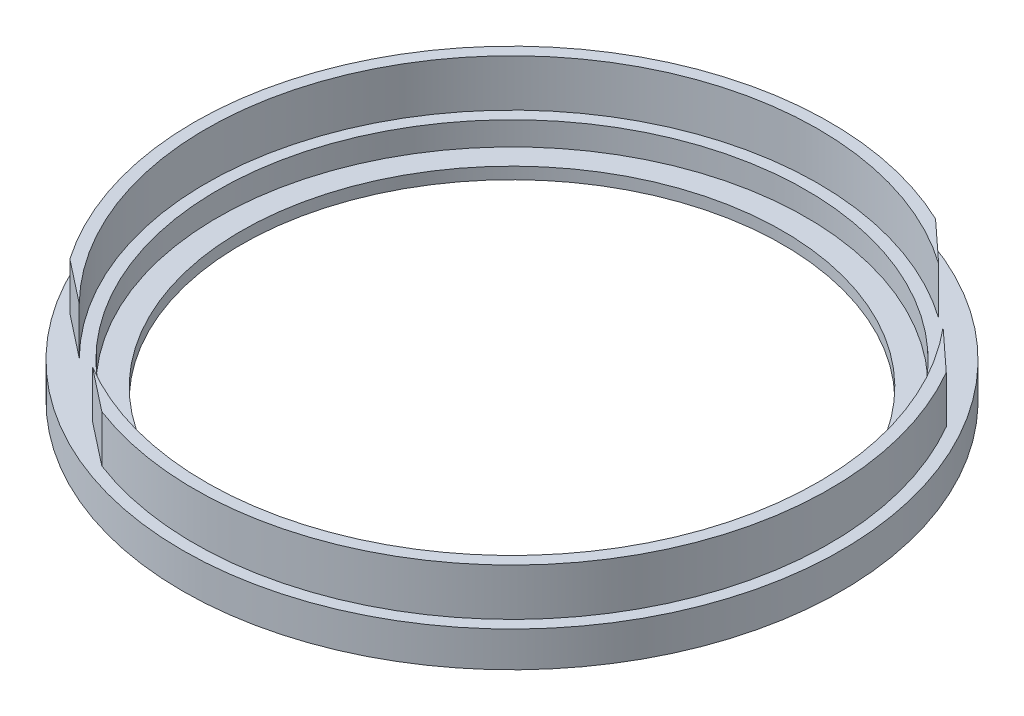
ISO-10303-21;
HEADER;
FILE_DESCRIPTION(('STEP AP214'),'2;1');
FILE_NAME('part.step','',(''),(''),'','','');
FILE_SCHEMA(('AUTOMOTIVE_DESIGN { 1 0 10303 214 1 1 1 1 }'));
ENDSEC;
DATA;
#1=APPLICATION_CONTEXT('core data for automotive mechanical design processes');
#2=APPLICATION_PROTOCOL_DEFINITION('international standard','automotive_design',2000,#1);
#3=PRODUCT_CONTEXT('',#1,'mechanical');
#4=PRODUCT('Part','Part','',(#3));
#5=PRODUCT_RELATED_PRODUCT_CATEGORY('part','',(#4));
#6=PRODUCT_DEFINITION_FORMATION('','',#4);
#7=PRODUCT_DEFINITION_CONTEXT('part definition',#1,'design');
#8=PRODUCT_DEFINITION('design','',#6,#7);
#9=PRODUCT_DEFINITION_SHAPE('','',#8);
#10=(LENGTH_UNIT() NAMED_UNIT(*) SI_UNIT(.MILLI.,.METRE.));
#11=(NAMED_UNIT(*) PLANE_ANGLE_UNIT() SI_UNIT($,.RADIAN.));
#12=(NAMED_UNIT(*) SI_UNIT($,.STERADIAN.) SOLID_ANGLE_UNIT());
#13=UNCERTAINTY_MEASURE_WITH_UNIT(LENGTH_MEASURE(1.E-05),#10,'distance_accuracy_value','');
#14=(GEOMETRIC_REPRESENTATION_CONTEXT(3) GLOBAL_UNCERTAINTY_ASSIGNED_CONTEXT((#13)) GLOBAL_UNIT_ASSIGNED_CONTEXT((#10,
#11,#12)) REPRESENTATION_CONTEXT('',''));
#15=CARTESIAN_POINT('',(0.,0.,0.));
#16=DIRECTION('',(0.,0.,1.));
#17=DIRECTION('',(1.,0.,0.));
#18=AXIS2_PLACEMENT_3D('',#15,#16,#17);
#19=CARTESIAN_POINT('',(-49.2601499183251,7.,-37.6292811876095));
#20=DIRECTION('',(0.,1.,0.));
#21=DIRECTION('',(0.,0.,1.));
#22=AXIS2_PLACEMENT_3D('',#19,#20,#21);
#23=PLANE('',#22);
#24=DIRECTION('',(-0.786877491768754,0.,-0.617109239071751));
#25=VECTOR('',#24,1.);
#26=CARTESIAN_POINT('',(-71.4689323117501,7.,-22.274477880452));
#27=LINE('',#26,#25);
#28=CARTESIAN_POINT('',(-58.8788924434501,7.,-12.400730055304));
#29=VERTEX_POINT('',#28);
#30=CARTESIAN_POINT('',(-62.5641349814272,7.,-15.2908841672153));
#31=VERTEX_POINT('',#30);
#32=EDGE_CURVE('E147',#29,#31,#27,.T.);
#33=ORIENTED_EDGE('',*,*,#32,.F.);
#34=CARTESIAN_POINT('',(-49.2601499183251,7.,-37.6292811876095));
#35=DIRECTION('',(0.,1.,0.));
#36=DIRECTION('',(0.,0.,1.));
#37=AXIS2_PLACEMENT_3D('',#34,#35,#36);
#38=CIRCLE('',#37,27.);
#39=CARTESIAN_POINT('',(-25.894954154866,7.,-51.1595297786456));
#40=VERTEX_POINT('',#39);
#41=EDGE_CURVE('E115',#29,#40,#38,.T.);
#42=ORIENTED_EDGE('',*,*,#41,.T.);
#43=DIRECTION('',(0.735026230949248,0.,0.678038671328223));
#44=VECTOR('',#43,1.);
#45=CARTESIAN_POINT('',(-37.655373850054,7.,-62.0081485198971));
#46=LINE('',#45,#44);
#47=CARTESIAN_POINT('',(-29.3373577833322,7.,-54.3350392831245));
#48=VERTEX_POINT('',#47);
#49=EDGE_CURVE('E145',#48,#40,#46,.T.);
#50=ORIENTED_EDGE('',*,*,#49,.F.);
#51=CARTESIAN_POINT('',(-49.2601499183251,7.,-37.6292811876095));
#52=DIRECTION('',(0.,1.,0.));
#53=DIRECTION('',(0.,0.,1.));
#54=AXIS2_PLACEMENT_3D('',#51,#52,#53);
#55=CIRCLE('',#54,26.);
#56=EDGE_CURVE('E126',#31,#48,#55,.T.);
#57=ORIENTED_EDGE('',*,*,#56,.F.);
#58=EDGE_LOOP('',(#33,#42,#50,#57));
#59=FACE_BOUND('',#58,.T.);
#60=ADVANCED_FACE('F34',(#59),#23,.T.);
#61=CARTESIAN_POINT('',(-49.2601499183251,7.,-37.6292811876095));
#62=DIRECTION('',(0.,-1.,0.));
#63=DIRECTION('',(0.,0.,-1.));
#64=AXIS2_PLACEMENT_3D('',#61,#62,#63);
#65=CYLINDRICAL_SURFACE('',#64,27.);
#66=CARTESIAN_POINT('',(-49.2601499183251,3.,-37.6292811876095));
#67=DIRECTION('',(0.,1.,0.));
#68=DIRECTION('',(0.,0.,1.));
#69=AXIS2_PLACEMENT_3D('',#66,#67,#68);
#70=CIRCLE('',#69,27.);
#71=CARTESIAN_POINT('',(-37.655373850054,3.,-62.0081485198971));
#72=VERTEX_POINT('',#71);
#73=CARTESIAN_POINT('',(-71.4689323117501,3.,-22.274477880452));
#74=VERTEX_POINT('',#73);
#75=EDGE_CURVE('E121',#72,#74,#70,.T.);
#76=ORIENTED_EDGE('',*,*,#75,.T.);
#77=DIRECTION('',(0.,1.,0.));
#78=VECTOR('',#77,1.);
#79=CARTESIAN_POINT('',(-71.4689323117501,3.,-22.274477880452));
#80=LINE('',#79,#78);
#81=CARTESIAN_POINT('',(-71.4689323117501,7.,-22.274477880452));
#82=VERTEX_POINT('',#81);
#83=EDGE_CURVE('E116',#74,#82,#80,.T.);
#84=ORIENTED_EDGE('',*,*,#83,.T.);
#85=CARTESIAN_POINT('',(-37.655373850054,7.,-62.0081485198971));
#86=VERTEX_POINT('',#85);
#87=EDGE_CURVE('E134',#86,#82,#38,.T.);
#88=ORIENTED_EDGE('',*,*,#87,.F.);
#89=DIRECTION('',(0.,1.,0.));
#90=VECTOR('',#89,1.);
#91=CARTESIAN_POINT('',(-37.655373850054,3.,-62.0081485198971));
#92=LINE('',#91,#90);
#93=EDGE_CURVE('E156',#72,#86,#92,.T.);
#94=ORIENTED_EDGE('',*,*,#93,.F.);
#95=EDGE_LOOP('',(#76,#84,#88,#94));
#96=FACE_BOUND('',#95,.T.);
#97=ADVANCED_FACE('F196',(#96),#65,.T.);
#98=CARTESIAN_POINT('',(-49.2601499183251,7.,-37.6292811876095));
#99=DIRECTION('',(0.,-1.,0.));
#100=DIRECTION('',(0.,0.,-1.));
#101=AXIS2_PLACEMENT_3D('',#98,#99,#100);
#102=CYLINDRICAL_SURFACE('',#101,26.);
#103=DIRECTION('',(0.,-1.,0.));
#104=VECTOR('',#103,1.);
#105=CARTESIAN_POINT('',(-62.5641349814272,7.,-15.2908841672153));
#106=LINE('',#105,#104);
#107=CARTESIAN_POINT('',(-62.5641349814272,3.,-15.2908841672153));
#108=VERTEX_POINT('',#107);
#109=EDGE_CURVE('E104',#31,#108,#106,.T.);
#110=ORIENTED_EDGE('',*,*,#109,.F.);
#111=ORIENTED_EDGE('',*,*,#56,.T.);
#112=DIRECTION('',(0.,-1.,0.));
#113=VECTOR('',#112,1.);
#114=CARTESIAN_POINT('',(-29.3373577833323,7.,-54.3350392831246));
#115=LINE('',#114,#113);
#116=CARTESIAN_POINT('',(-29.3373577833323,3.,-54.3350392831246));
#117=VERTEX_POINT('',#116);
#118=EDGE_CURVE('E153',#117,#48,#115,.F.);
#119=ORIENTED_EDGE('',*,*,#118,.F.);
#120=CARTESIAN_POINT('',(-49.2601499183251,3.,-37.6292811876095));
#121=DIRECTION('',(0.,1.,0.));
#122=DIRECTION('',(0.,0.,1.));
#123=AXIS2_PLACEMENT_3D('',#120,#121,#122);
#124=CIRCLE('',#123,26.);
#125=EDGE_CURVE('E38',#117,#108,#124,.F.);
#126=ORIENTED_EDGE('',*,*,#125,.T.);
#127=EDGE_LOOP('',(#110,#111,#119,#126));
#128=FACE_BOUND('',#127,.T.);
#129=ADVANCED_FACE('F180',(#128),#102,.F.);
#130=CARTESIAN_POINT('',(-49.2601499183251,3.,-37.6292811876095));
#131=DIRECTION('',(0.,-1.,0.));
#132=DIRECTION('',(0.,0.,-1.));
#133=AXIS2_PLACEMENT_3D('',#130,#131,#132);
#134=CYLINDRICAL_SURFACE('',#133,28.);
#135=CARTESIAN_POINT('',(-49.2601499183251,3.,-37.6292811876095));
#136=DIRECTION('',(0.,1.,0.));
#137=DIRECTION('',(0.,0.,1.));
#138=AXIS2_PLACEMENT_3D('',#135,#136,#137);
#139=CIRCLE('',#138,28.);
#140=CARTESIAN_POINT('',(-49.2601499183251,3.,-9.62928118760946));
#141=VERTEX_POINT('',#140);
#142=EDGE_CURVE('E130',#141,#141,#139,.T.);
#143=ORIENTED_EDGE('',*,*,#142,.F.);
#144=EDGE_LOOP('',(#143));
#145=FACE_BOUND('',#144,.T.);
#146=CARTESIAN_POINT('',(-49.2601499183251,0.,-37.6292811876095));
#147=DIRECTION('',(0.,1.,0.));
#148=DIRECTION('',(0.,0.,1.));
#149=AXIS2_PLACEMENT_3D('',#146,#147,#148);
#150=CIRCLE('',#149,28.);
#151=CARTESIAN_POINT('',(-49.2601499183251,0.,-9.62928118760946));
#152=VERTEX_POINT('',#151);
#153=EDGE_CURVE('E132',#152,#152,#150,.T.);
#154=ORIENTED_EDGE('',*,*,#153,.T.);
#155=EDGE_LOOP('',(#154));
#156=FACE_BOUND('',#155,.T.);
#157=ADVANCED_FACE('F36',(#145,#156),#134,.T.);
#158=CARTESIAN_POINT('',(-49.2601499183251,3.,-37.6292811876095));
#159=DIRECTION('',(0.,1.,0.));
#160=DIRECTION('',(0.,0.,1.));
#161=AXIS2_PLACEMENT_3D('',#158,#159,#160);
#162=PLANE('',#161);
#163=ORIENTED_EDGE('',*,*,#142,.T.);
#164=EDGE_LOOP('',(#163));
#165=FACE_BOUND('',#164,.T.);
#166=CARTESIAN_POINT('',(-58.8788924434501,3.,-12.400730055304));
#167=VERTEX_POINT('',#166);
#168=CARTESIAN_POINT('',(-25.894954154866,3.,-51.1595297786456));
#169=VERTEX_POINT('',#168);
#170=EDGE_CURVE('E113',#167,#169,#70,.T.);
#171=ORIENTED_EDGE('',*,*,#170,.F.);
#172=DIRECTION('',(-0.786877491768754,0.,-0.617109239071751));
#173=VECTOR('',#172,1.);
#174=CARTESIAN_POINT('',(-71.4689323117501,3.,-22.274477880452));
#175=LINE('',#174,#173);
#176=EDGE_CURVE('E57',#167,#108,#175,.T.);
#177=ORIENTED_EDGE('',*,*,#176,.T.);
#178=ORIENTED_EDGE('',*,*,#125,.F.);
#179=DIRECTION('',(0.735026230949248,0.,0.678038671328223));
#180=VECTOR('',#179,1.);
#181=CARTESIAN_POINT('',(-37.655373850054,3.,-62.0081485198971));
#182=LINE('',#181,#180);
#183=EDGE_CURVE('E119',#117,#169,#182,.T.);
#184=ORIENTED_EDGE('',*,*,#183,.T.);
#185=EDGE_LOOP('',(#171,#177,#178,#184));
#186=FACE_BOUND('',#185,.T.);
#187=CARTESIAN_POINT('',(-67.783689773773,3.,-19.3843237685407));
#188=VERTEX_POINT('',#187);
#189=EDGE_CURVE('E106',#188,#74,#175,.T.);
#190=ORIENTED_EDGE('',*,*,#189,.T.);
#191=ORIENTED_EDGE('',*,*,#75,.F.);
#192=CARTESIAN_POINT('',(-34.2129702215877,3.,-58.8326390154181));
#193=VERTEX_POINT('',#192);
#194=EDGE_CURVE('E49',#72,#193,#182,.T.);
#195=ORIENTED_EDGE('',*,*,#194,.T.);
#196=EDGE_CURVE('E11',#188,#193,#124,.F.);
#197=ORIENTED_EDGE('',*,*,#196,.F.);
#198=EDGE_LOOP('',(#190,#191,#195,#197));
#199=FACE_BOUND('',#198,.T.);
#200=CARTESIAN_POINT('',(-49.2601499183251,3.,-37.6292811876095));
#201=DIRECTION('',(0.,1.,0.));
#202=DIRECTION('',(0.,0.,1.));
#203=AXIS2_PLACEMENT_3D('',#200,#201,#202);
#204=CIRCLE('',#203,25.);
#205=CARTESIAN_POINT('',(-49.2601499183251,3.,-12.6292811876095));
#206=VERTEX_POINT('',#205);
#207=EDGE_CURVE('E171',#206,#206,#204,.T.);
#208=ORIENTED_EDGE('',*,*,#207,.F.);
#209=EDGE_LOOP('',(#208));
#210=FACE_BOUND('',#209,.T.);
#211=ADVANCED_FACE('F118',(#165,#186,#199,#210),#162,.T.);
#212=CARTESIAN_POINT('',(-49.2601499183251,0.,-37.6292811876095));
#213=DIRECTION('',(0.,1.,0.));
#214=DIRECTION('',(0.,0.,1.));
#215=AXIS2_PLACEMENT_3D('',#212,#213,#214);
#216=PLANE('',#215);
#217=CARTESIAN_POINT('',(-49.2601499183251,0.,-37.6292811876095));
#218=DIRECTION('',(0.,1.,0.));
#219=DIRECTION('',(0.,0.,1.));
#220=AXIS2_PLACEMENT_3D('',#217,#218,#219);
#221=CIRCLE('',#220,23.);
#222=CARTESIAN_POINT('',(-49.2601499183251,0.,-14.6292811876095));
#223=VERTEX_POINT('',#222);
#224=EDGE_CURVE('E168',#223,#223,#221,.T.);
#225=ORIENTED_EDGE('',*,*,#224,.T.);
#226=EDGE_LOOP('',(#225));
#227=FACE_BOUND('',#226,.T.);
#228=ORIENTED_EDGE('',*,*,#153,.F.);
#229=EDGE_LOOP('',(#228));
#230=FACE_BOUND('',#229,.T.);
#231=ADVANCED_FACE('F206',(#227,#230),#216,.F.);
#232=CARTESIAN_POINT('',(-67.783689773773,7.,-19.3843237685407));
#233=VERTEX_POINT('',#232);
#234=EDGE_CURVE('E148',#233,#82,#27,.T.);
#235=ORIENTED_EDGE('',*,*,#234,.F.);
#236=CARTESIAN_POINT('',(-34.2129702215877,7.,-58.8326390154181));
#237=VERTEX_POINT('',#236);
#238=EDGE_CURVE('E122',#237,#233,#55,.T.);
#239=ORIENTED_EDGE('',*,*,#238,.F.);
#240=EDGE_CURVE('E157',#86,#237,#46,.T.);
#241=ORIENTED_EDGE('',*,*,#240,.F.);
#242=ORIENTED_EDGE('',*,*,#87,.T.);
#243=EDGE_LOOP('',(#235,#239,#241,#242));
#244=FACE_BOUND('',#243,.T.);
#245=ADVANCED_FACE('F198',(#244),#23,.T.);
#246=ORIENTED_EDGE('',*,*,#41,.F.);
#247=DIRECTION('',(0.,1.,0.));
#248=VECTOR('',#247,1.);
#249=CARTESIAN_POINT('',(-58.8788924434501,3.,-12.400730055304));
#250=LINE('',#249,#248);
#251=EDGE_CURVE('E101',#167,#29,#250,.T.);
#252=ORIENTED_EDGE('',*,*,#251,.F.);
#253=ORIENTED_EDGE('',*,*,#170,.T.);
#254=DIRECTION('',(0.,1.,0.));
#255=VECTOR('',#254,1.);
#256=CARTESIAN_POINT('',(-25.894954154866,3.,-51.1595297786456));
#257=LINE('',#256,#255);
#258=EDGE_CURVE('E150',#169,#40,#257,.T.);
#259=ORIENTED_EDGE('',*,*,#258,.T.);
#260=EDGE_LOOP('',(#246,#252,#253,#259));
#261=FACE_BOUND('',#260,.T.);
#262=ADVANCED_FACE('F111',(#261),#65,.T.);
#263=DIRECTION('',(0.,-1.,0.));
#264=VECTOR('',#263,1.);
#265=CARTESIAN_POINT('',(-67.783689773773,7.,-19.3843237685407));
#266=LINE('',#265,#264);
#267=EDGE_CURVE('E164',#188,#233,#266,.F.);
#268=ORIENTED_EDGE('',*,*,#267,.F.);
#269=ORIENTED_EDGE('',*,*,#196,.T.);
#270=DIRECTION('',(0.,-1.,0.));
#271=VECTOR('',#270,1.);
#272=CARTESIAN_POINT('',(-34.2129702215877,7.,-58.8326390154181));
#273=LINE('',#272,#271);
#274=EDGE_CURVE('E162',#237,#193,#273,.T.);
#275=ORIENTED_EDGE('',*,*,#274,.F.);
#276=ORIENTED_EDGE('',*,*,#238,.T.);
#277=EDGE_LOOP('',(#268,#269,#275,#276));
#278=FACE_BOUND('',#277,.T.);
#279=ADVANCED_FACE('F211',(#278),#102,.F.);
#280=CARTESIAN_POINT('',(-49.2601499183251,1.,-37.6292811876095));
#281=DIRECTION('',(0.,1.,0.));
#282=DIRECTION('',(0.,0.,1.));
#283=AXIS2_PLACEMENT_3D('',#280,#281,#282);
#284=CYLINDRICAL_SURFACE('',#283,25.);
#285=CARTESIAN_POINT('',(-49.2601499183251,1.,-37.6292811876095));
#286=DIRECTION('',(0.,1.,0.));
#287=DIRECTION('',(0.,0.,1.));
#288=AXIS2_PLACEMENT_3D('',#285,#286,#287);
#289=CIRCLE('',#288,25.);
#290=CARTESIAN_POINT('',(-49.2601499183251,1.,-12.6292811876095));
#291=VERTEX_POINT('',#290);
#292=EDGE_CURVE('E174',#291,#291,#289,.T.);
#293=ORIENTED_EDGE('',*,*,#292,.F.);
#294=EDGE_LOOP('',(#293));
#295=FACE_BOUND('',#294,.T.);
#296=ORIENTED_EDGE('',*,*,#207,.T.);
#297=EDGE_LOOP('',(#296));
#298=FACE_BOUND('',#297,.T.);
#299=ADVANCED_FACE('F226',(#295,#298),#284,.F.);
#300=CARTESIAN_POINT('',(-49.2601499183251,1.,-37.6292811876095));
#301=DIRECTION('',(0.,1.,0.));
#302=DIRECTION('',(0.,0.,1.));
#303=AXIS2_PLACEMENT_3D('',#300,#301,#302);
#304=PLANE('',#303);
#305=CARTESIAN_POINT('',(-49.2601499183251,1.,-37.6292811876095));
#306=DIRECTION('',(0.,1.,0.));
#307=DIRECTION('',(0.,0.,1.));
#308=AXIS2_PLACEMENT_3D('',#305,#306,#307);
#309=CIRCLE('',#308,23.);
#310=CARTESIAN_POINT('',(-49.2601499183251,1.,-14.6292811876095));
#311=VERTEX_POINT('',#310);
#312=EDGE_CURVE('E167',#311,#311,#309,.T.);
#313=ORIENTED_EDGE('',*,*,#312,.F.);
#314=EDGE_LOOP('',(#313));
#315=FACE_BOUND('',#314,.T.);
#316=ORIENTED_EDGE('',*,*,#292,.T.);
#317=EDGE_LOOP('',(#316));
#318=FACE_BOUND('',#317,.T.);
#319=ADVANCED_FACE('F228',(#315,#318),#304,.T.);
#320=CARTESIAN_POINT('',(-49.2601499183251,0.,-37.6292811876095));
#321=DIRECTION('',(0.,1.,0.));
#322=DIRECTION('',(0.,0.,1.));
#323=AXIS2_PLACEMENT_3D('',#320,#321,#322);
#324=CYLINDRICAL_SURFACE('',#323,23.);
#325=ORIENTED_EDGE('',*,*,#224,.F.);
#326=EDGE_LOOP('',(#325));
#327=FACE_BOUND('',#326,.T.);
#328=ORIENTED_EDGE('',*,*,#312,.T.);
#329=EDGE_LOOP('',(#328));
#330=FACE_BOUND('',#329,.T.);
#331=ADVANCED_FACE('F192',(#327,#330),#324,.F.);
#332=CARTESIAN_POINT('',(-37.655373850054,3.,-62.0081485198971));
#333=DIRECTION('',(-0.678038671328223,0.,0.735026230949248));
#334=DIRECTION('',(0.735026230949248,0.,0.678038671328223));
#335=AXIS2_PLACEMENT_3D('',#332,#333,#334);
#336=PLANE('',#335);
#337=ORIENTED_EDGE('',*,*,#274,.T.);
#338=ORIENTED_EDGE('',*,*,#194,.F.);
#339=ORIENTED_EDGE('',*,*,#93,.T.);
#340=ORIENTED_EDGE('',*,*,#240,.T.);
#341=EDGE_LOOP('',(#337,#338,#339,#340));
#342=FACE_BOUND('',#341,.T.);
#343=ADVANCED_FACE('F184',(#342),#336,.F.);
#344=ORIENTED_EDGE('',*,*,#118,.T.);
#345=ORIENTED_EDGE('',*,*,#49,.T.);
#346=ORIENTED_EDGE('',*,*,#258,.F.);
#347=ORIENTED_EDGE('',*,*,#183,.F.);
#348=EDGE_LOOP('',(#344,#345,#346,#347));
#349=FACE_BOUND('',#348,.T.);
#350=ADVANCED_FACE('F182',(#349),#336,.F.);
#351=CARTESIAN_POINT('',(-71.4689323117501,3.,-22.274477880452));
#352=DIRECTION('',(0.617109239071751,0.,-0.786877491768753));
#353=DIRECTION('',(-0.786877491768753,0.,-0.617109239071751));
#354=AXIS2_PLACEMENT_3D('',#351,#352,#353);
#355=PLANE('',#354);
#356=ORIENTED_EDGE('',*,*,#109,.T.);
#357=ORIENTED_EDGE('',*,*,#176,.F.);
#358=ORIENTED_EDGE('',*,*,#251,.T.);
#359=ORIENTED_EDGE('',*,*,#32,.T.);
#360=EDGE_LOOP('',(#356,#357,#358,#359));
#361=FACE_BOUND('',#360,.T.);
#362=ADVANCED_FACE('F100',(#361),#355,.F.);
#363=ORIENTED_EDGE('',*,*,#267,.T.);
#364=ORIENTED_EDGE('',*,*,#234,.T.);
#365=ORIENTED_EDGE('',*,*,#83,.F.);
#366=ORIENTED_EDGE('',*,*,#189,.F.);
#367=EDGE_LOOP('',(#363,#364,#365,#366));
#368=FACE_BOUND('',#367,.T.);
#369=ADVANCED_FACE('F190',(#368),#355,.F.);
#370=CLOSED_SHELL('',(#60,#97,#129,#157,#211,#231,#245,#262,#279,#299,#319,#331,#343,#350,#362,#369));
#371=MANIFOLD_SOLID_BREP('B2',#370);
#372=ADVANCED_BREP_SHAPE_REPRESENTATION('',(#18,#371),#14);
#373=SHAPE_DEFINITION_REPRESENTATION(#9,#372);
ENDSEC;
END-ISO-10303-21;
